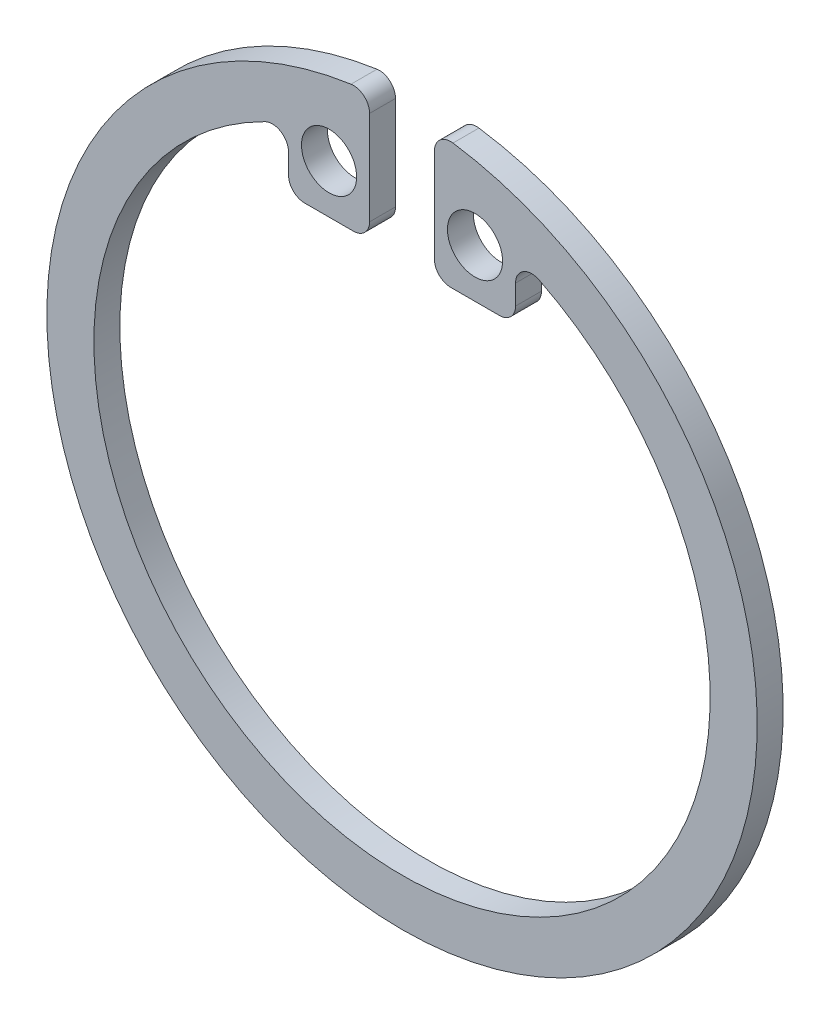
ISO-10303-21;
HEADER;
FILE_DESCRIPTION(('STEP AP214'),'2;1');
FILE_NAME('part.step','',(''),(''),'','','');
FILE_SCHEMA(('AUTOMOTIVE_DESIGN { 1 0 10303 214 1 1 1 1 }'));
ENDSEC;
DATA;
#1=APPLICATION_CONTEXT('core data for automotive mechanical design processes');
#2=APPLICATION_PROTOCOL_DEFINITION('international standard','automotive_design',2000,#1);
#3=PRODUCT_CONTEXT('',#1,'mechanical');
#4=PRODUCT('Part','Part','',(#3));
#5=PRODUCT_RELATED_PRODUCT_CATEGORY('part','',(#4));
#6=PRODUCT_DEFINITION_FORMATION('','',#4);
#7=PRODUCT_DEFINITION_CONTEXT('part definition',#1,'design');
#8=PRODUCT_DEFINITION('design','',#6,#7);
#9=PRODUCT_DEFINITION_SHAPE('','',#8);
#10=(LENGTH_UNIT() NAMED_UNIT(*) SI_UNIT(.MILLI.,.METRE.));
#11=(NAMED_UNIT(*) PLANE_ANGLE_UNIT() SI_UNIT($,.RADIAN.));
#12=(NAMED_UNIT(*) SI_UNIT($,.STERADIAN.) SOLID_ANGLE_UNIT());
#13=UNCERTAINTY_MEASURE_WITH_UNIT(LENGTH_MEASURE(1.E-05),#10,'distance_accuracy_value','');
#14=(GEOMETRIC_REPRESENTATION_CONTEXT(3) GLOBAL_UNCERTAINTY_ASSIGNED_CONTEXT((#13)) GLOBAL_UNIT_ASSIGNED_CONTEXT((#10,
#11,#12)) REPRESENTATION_CONTEXT('',''));
#15=CARTESIAN_POINT('',(0.,0.,0.));
#16=DIRECTION('',(0.,0.,1.));
#17=DIRECTION('',(1.,0.,0.));
#18=AXIS2_PLACEMENT_3D('',#15,#16,#17);
#19=CARTESIAN_POINT('',(0.,0.,0.8));
#20=DIRECTION('',(0.,0.,1.));
#21=DIRECTION('',(1.,0.,0.));
#22=AXIS2_PLACEMENT_3D('',#19,#20,#21);
#23=PLANE('',#22);
#24=CARTESIAN_POINT('',(2.25,8.44722181384559,0.8));
#25=DIRECTION('',(0.,0.,1.));
#26=DIRECTION('',(1.,0.,0.));
#27=AXIS2_PLACEMENT_3D('',#24,#25,#26);
#28=CIRCLE('',#27,0.85);
#29=CARTESIAN_POINT('',(3.1,8.44722181384559,0.8));
#30=VERTEX_POINT('',#29);
#31=EDGE_CURVE('E493',#30,#30,#28,.T.);
#32=ORIENTED_EDGE('',*,*,#31,.F.);
#33=EDGE_LOOP('',(#32));
#34=FACE_BOUND('',#33,.T.);
#35=CARTESIAN_POINT('',(-2.25,8.44722181384559,0.8));
#36=DIRECTION('',(0.,0.,1.));
#37=DIRECTION('',(1.,0.,0.));
#38=AXIS2_PLACEMENT_3D('',#35,#36,#37);
#39=CIRCLE('',#38,0.85);
#40=CARTESIAN_POINT('',(-1.4,8.44722181384559,0.8));
#41=VERTEX_POINT('',#40);
#42=EDGE_CURVE('E498',#41,#41,#39,.T.);
#43=ORIENTED_EDGE('',*,*,#42,.F.);
#44=EDGE_LOOP('',(#43));
#45=FACE_BOUND('',#44,.T.);
#46=DIRECTION('',(1.,0.,0.));
#47=VECTOR('',#46,1.);
#48=CARTESIAN_POINT('',(1.,6.94722181384559,0.8));
#49=LINE('',#48,#47);
#50=CARTESIAN_POINT('',(1.5,6.94722181384559,0.8));
#51=VERTEX_POINT('',#50);
#52=CARTESIAN_POINT('',(3.,6.94722181384559,0.8));
#53=VERTEX_POINT('',#52);
#54=EDGE_CURVE('E280',#51,#53,#49,.T.);
#55=ORIENTED_EDGE('',*,*,#54,.T.);
#56=CARTESIAN_POINT('',(3.,7.44722181384559,0.8));
#57=DIRECTION('',(0.,0.,1.));
#58=DIRECTION('',(1.,0.,0.));
#59=AXIS2_PLACEMENT_3D('',#56,#57,#58);
#60=CIRCLE('',#59,0.5);
#61=CARTESIAN_POINT('',(3.5,7.44722181384559,0.8));
#62=VERTEX_POINT('',#61);
#63=EDGE_CURVE('E232',#53,#62,#60,.T.);
#64=ORIENTED_EDGE('',*,*,#63,.T.);
#65=DIRECTION('',(0.,1.,0.));
#66=VECTOR('',#65,1.);
#67=CARTESIAN_POINT('',(3.5,9.44722181384559,0.8));
#68=LINE('',#67,#66);
#69=CARTESIAN_POINT('',(3.5,8.06225774829855,0.8));
#70=VERTEX_POINT('',#69);
#71=EDGE_CURVE('E279',#62,#70,#68,.T.);
#72=ORIENTED_EDGE('',*,*,#71,.T.);
#73=CARTESIAN_POINT('',(4.,8.06225774829855,0.8));
#74=DIRECTION('',(0.,0.,1.));
#75=DIRECTION('',(1.,0.,0.));
#76=AXIS2_PLACEMENT_3D('',#73,#74,#75);
#77=CIRCLE('',#76,0.5);
#78=CARTESIAN_POINT('',(4.22222222222222,8.51016095653736,0.8));
#79=VERTEX_POINT('',#78);
#80=EDGE_CURVE('E169',#70,#79,#77,.F.);
#81=ORIENTED_EDGE('',*,*,#80,.T.);
#82=CARTESIAN_POINT('',(0.,0.,0.8));
#83=DIRECTION('',(0.,0.,1.));
#84=DIRECTION('',(1.,0.,0.));
#85=AXIS2_PLACEMENT_3D('',#82,#83,#84);
#86=CIRCLE('',#85,9.5);
#87=CARTESIAN_POINT('',(-4.22222222222222,8.51016095653736,0.8));
#88=VERTEX_POINT('',#87);
#89=EDGE_CURVE('E165',#88,#79,#86,.T.);
#90=ORIENTED_EDGE('',*,*,#89,.F.);
#91=CARTESIAN_POINT('',(-4.,8.06225774829855,0.8));
#92=DIRECTION('',(0.,0.,1.));
#93=DIRECTION('',(1.,0.,0.));
#94=AXIS2_PLACEMENT_3D('',#91,#92,#93);
#95=CIRCLE('',#94,0.5);
#96=CARTESIAN_POINT('',(-3.5,8.06225774829855,0.8));
#97=VERTEX_POINT('',#96);
#98=EDGE_CURVE('E160',#88,#97,#95,.F.);
#99=ORIENTED_EDGE('',*,*,#98,.T.);
#100=DIRECTION('',(0.,-1.,0.));
#101=VECTOR('',#100,1.);
#102=CARTESIAN_POINT('',(-3.5,9.44722181384559,0.8));
#103=LINE('',#102,#101);
#104=CARTESIAN_POINT('',(-3.5,7.44722181384559,0.8));
#105=VERTEX_POINT('',#104);
#106=EDGE_CURVE('E163',#97,#105,#103,.T.);
#107=ORIENTED_EDGE('',*,*,#106,.T.);
#108=CARTESIAN_POINT('',(-3.,7.44722181384559,0.8));
#109=DIRECTION('',(0.,0.,1.));
#110=DIRECTION('',(1.,0.,0.));
#111=AXIS2_PLACEMENT_3D('',#108,#109,#110);
#112=CIRCLE('',#111,0.5);
#113=CARTESIAN_POINT('',(-3.,6.94722181384559,0.8));
#114=VERTEX_POINT('',#113);
#115=EDGE_CURVE('E226',#105,#114,#112,.T.);
#116=ORIENTED_EDGE('',*,*,#115,.T.);
#117=DIRECTION('',(1.,0.,0.));
#118=VECTOR('',#117,1.);
#119=CARTESIAN_POINT('',(-1.,6.94722181384559,0.8));
#120=LINE('',#119,#118);
#121=CARTESIAN_POINT('',(-1.5,6.94722181384559,0.8));
#122=VERTEX_POINT('',#121);
#123=EDGE_CURVE('E177',#114,#122,#120,.T.);
#124=ORIENTED_EDGE('',*,*,#123,.T.);
#125=CARTESIAN_POINT('',(-1.5,7.44722181384559,0.8));
#126=DIRECTION('',(0.,0.,1.));
#127=DIRECTION('',(1.,0.,0.));
#128=AXIS2_PLACEMENT_3D('',#125,#126,#127);
#129=CIRCLE('',#128,0.5);
#130=CARTESIAN_POINT('',(-1.,7.44722181384559,0.8));
#131=VERTEX_POINT('',#130);
#132=EDGE_CURVE('E228',#122,#131,#129,.T.);
#133=ORIENTED_EDGE('',*,*,#132,.T.);
#134=DIRECTION('',(0.,1.,0.));
#135=VECTOR('',#134,1.);
#136=CARTESIAN_POINT('',(-1.,0.,0.8));
#137=LINE('',#136,#135);
#138=CARTESIAN_POINT('',(-1.,10.3417841787575,0.8));
#139=VERTEX_POINT('',#138);
#140=EDGE_CURVE('E255',#131,#139,#137,.T.);
#141=ORIENTED_EDGE('',*,*,#140,.T.);
#142=CARTESIAN_POINT('',(-1.5,10.3417841787575,0.8));
#143=DIRECTION('',(0.,0.,1.));
#144=DIRECTION('',(1.,0.,0.));
#145=AXIS2_PLACEMENT_3D('',#142,#143,#144);
#146=CIRCLE('',#145,0.5);
#147=CARTESIAN_POINT('',(-1.57177033492823,10.8366063882675,0.8));
#148=VERTEX_POINT('',#147);
#149=EDGE_CURVE('E201',#139,#148,#146,.T.);
#150=ORIENTED_EDGE('',*,*,#149,.T.);
#151=CARTESIAN_POINT('',(0.,0.,0.8));
#152=DIRECTION('',(0.,0.,1.));
#153=DIRECTION('',(1.,0.,0.));
#154=AXIS2_PLACEMENT_3D('',#151,#152,#153);
#155=CIRCLE('',#154,10.95);
#156=CARTESIAN_POINT('',(1.57177033492823,10.8366063882675,0.8));
#157=VERTEX_POINT('',#156);
#158=EDGE_CURVE('E183',#148,#157,#155,.T.);
#159=ORIENTED_EDGE('',*,*,#158,.T.);
#160=CARTESIAN_POINT('',(1.5,10.3417841787575,0.8));
#161=DIRECTION('',(0.,0.,1.));
#162=DIRECTION('',(1.,0.,0.));
#163=AXIS2_PLACEMENT_3D('',#160,#161,#162);
#164=CIRCLE('',#163,0.5);
#165=CARTESIAN_POINT('',(1.,10.3417841787575,0.8));
#166=VERTEX_POINT('',#165);
#167=EDGE_CURVE('E203',#157,#166,#164,.T.);
#168=ORIENTED_EDGE('',*,*,#167,.T.);
#169=DIRECTION('',(0.,1.,0.));
#170=VECTOR('',#169,1.);
#171=CARTESIAN_POINT('',(1.,0.,0.8));
#172=LINE('',#171,#170);
#173=CARTESIAN_POINT('',(1.,7.44722181384559,0.8));
#174=VERTEX_POINT('',#173);
#175=EDGE_CURVE('E264',#174,#166,#172,.T.);
#176=ORIENTED_EDGE('',*,*,#175,.F.);
#177=CARTESIAN_POINT('',(1.5,7.44722181384559,0.8));
#178=DIRECTION('',(0.,0.,1.));
#179=DIRECTION('',(1.,0.,0.));
#180=AXIS2_PLACEMENT_3D('',#177,#178,#179);
#181=CIRCLE('',#180,0.5);
#182=EDGE_CURVE('E230',#174,#51,#181,.T.);
#183=ORIENTED_EDGE('',*,*,#182,.T.);
#184=EDGE_LOOP('',(#55,#64,#72,#81,#90,#99,#107,#116,#124,#133,#141,#150,#159,#168,#176,#183));
#185=FACE_BOUND('',#184,.T.);
#186=ADVANCED_FACE('F44',(#34,#45,#185),#23,.T.);
#187=CARTESIAN_POINT('',(0.,0.,0.));
#188=DIRECTION('',(0.,0.,1.));
#189=DIRECTION('',(1.,0.,0.));
#190=AXIS2_PLACEMENT_3D('',#187,#188,#189);
#191=PLANE('',#190);
#192=CARTESIAN_POINT('',(2.25,8.44722181384559,0.));
#193=DIRECTION('',(0.,0.,1.));
#194=DIRECTION('',(1.,0.,0.));
#195=AXIS2_PLACEMENT_3D('',#192,#193,#194);
#196=CIRCLE('',#195,0.85);
#197=CARTESIAN_POINT('',(3.1,8.44722181384559,0.));
#198=VERTEX_POINT('',#197);
#199=EDGE_CURVE('E178',#198,#198,#196,.T.);
#200=ORIENTED_EDGE('',*,*,#199,.T.);
#201=EDGE_LOOP('',(#200));
#202=FACE_BOUND('',#201,.T.);
#203=CARTESIAN_POINT('',(-2.25,8.44722181384559,0.));
#204=DIRECTION('',(0.,0.,1.));
#205=DIRECTION('',(1.,0.,0.));
#206=AXIS2_PLACEMENT_3D('',#203,#204,#205);
#207=CIRCLE('',#206,0.85);
#208=CARTESIAN_POINT('',(-1.4,8.44722181384559,0.));
#209=VERTEX_POINT('',#208);
#210=EDGE_CURVE('E494',#209,#209,#207,.T.);
#211=ORIENTED_EDGE('',*,*,#210,.T.);
#212=EDGE_LOOP('',(#211));
#213=FACE_BOUND('',#212,.T.);
#214=DIRECTION('',(0.,-1.,0.));
#215=VECTOR('',#214,1.);
#216=CARTESIAN_POINT('',(3.5,9.44722181384559,0.));
#217=LINE('',#216,#215);
#218=CARTESIAN_POINT('',(3.5,8.06225774829855,0.));
#219=VERTEX_POINT('',#218);
#220=CARTESIAN_POINT('',(3.5,7.44722181384559,0.));
#221=VERTEX_POINT('',#220);
#222=EDGE_CURVE('E276',#219,#221,#217,.T.);
#223=ORIENTED_EDGE('',*,*,#222,.T.);
#224=CARTESIAN_POINT('',(3.,7.44722181384559,0.));
#225=DIRECTION('',(0.,0.,1.));
#226=DIRECTION('',(1.,0.,0.));
#227=AXIS2_PLACEMENT_3D('',#224,#225,#226);
#228=CIRCLE('',#227,0.5);
#229=CARTESIAN_POINT('',(3.,6.94722181384559,0.));
#230=VERTEX_POINT('',#229);
#231=EDGE_CURVE('E241',#221,#230,#228,.F.);
#232=ORIENTED_EDGE('',*,*,#231,.T.);
#233=DIRECTION('',(-1.,0.,0.));
#234=VECTOR('',#233,1.);
#235=CARTESIAN_POINT('',(1.,6.94722181384559,0.));
#236=LINE('',#235,#234);
#237=CARTESIAN_POINT('',(1.5,6.94722181384559,0.));
#238=VERTEX_POINT('',#237);
#239=EDGE_CURVE('E278',#230,#238,#236,.T.);
#240=ORIENTED_EDGE('',*,*,#239,.T.);
#241=CARTESIAN_POINT('',(1.5,7.44722181384559,0.));
#242=DIRECTION('',(0.,0.,1.));
#243=DIRECTION('',(1.,0.,0.));
#244=AXIS2_PLACEMENT_3D('',#241,#242,#243);
#245=CIRCLE('',#244,0.5);
#246=CARTESIAN_POINT('',(1.,7.44722181384559,0.));
#247=VERTEX_POINT('',#246);
#248=EDGE_CURVE('E239',#238,#247,#245,.F.);
#249=ORIENTED_EDGE('',*,*,#248,.T.);
#250=DIRECTION('',(0.,1.,0.));
#251=VECTOR('',#250,1.);
#252=CARTESIAN_POINT('',(1.,0.,0.));
#253=LINE('',#252,#251);
#254=CARTESIAN_POINT('',(1.,10.3417841787575,0.));
#255=VERTEX_POINT('',#254);
#256=EDGE_CURVE('E263',#247,#255,#253,.T.);
#257=ORIENTED_EDGE('',*,*,#256,.T.);
#258=CARTESIAN_POINT('',(1.5,10.3417841787575,0.));
#259=DIRECTION('',(0.,0.,1.));
#260=DIRECTION('',(1.,0.,0.));
#261=AXIS2_PLACEMENT_3D('',#258,#259,#260);
#262=CIRCLE('',#261,0.5);
#263=CARTESIAN_POINT('',(1.57177033492823,10.8366063882675,0.));
#264=VERTEX_POINT('',#263);
#265=EDGE_CURVE('E212',#255,#264,#262,.F.);
#266=ORIENTED_EDGE('',*,*,#265,.T.);
#267=CARTESIAN_POINT('',(0.,0.,0.));
#268=DIRECTION('',(0.,0.,1.));
#269=DIRECTION('',(1.,0.,0.));
#270=AXIS2_PLACEMENT_3D('',#267,#268,#269);
#271=CIRCLE('',#270,10.95);
#272=CARTESIAN_POINT('',(-1.57177033492823,10.8366063882675,0.));
#273=VERTEX_POINT('',#272);
#274=EDGE_CURVE('E188',#273,#264,#271,.T.);
#275=ORIENTED_EDGE('',*,*,#274,.F.);
#276=CARTESIAN_POINT('',(-1.5,10.3417841787575,0.));
#277=DIRECTION('',(0.,0.,1.));
#278=DIRECTION('',(1.,0.,0.));
#279=AXIS2_PLACEMENT_3D('',#276,#277,#278);
#280=CIRCLE('',#279,0.5);
#281=CARTESIAN_POINT('',(-1.,10.3417841787575,0.));
#282=VERTEX_POINT('',#281);
#283=EDGE_CURVE('E209',#273,#282,#280,.F.);
#284=ORIENTED_EDGE('',*,*,#283,.T.);
#285=DIRECTION('',(0.,1.,0.));
#286=VECTOR('',#285,1.);
#287=CARTESIAN_POINT('',(-1.,0.,0.));
#288=LINE('',#287,#286);
#289=CARTESIAN_POINT('',(-1.,7.44722181384559,0.));
#290=VERTEX_POINT('',#289);
#291=EDGE_CURVE('E254',#290,#282,#288,.T.);
#292=ORIENTED_EDGE('',*,*,#291,.F.);
#293=CARTESIAN_POINT('',(-1.5,7.44722181384559,0.));
#294=DIRECTION('',(0.,0.,1.));
#295=DIRECTION('',(1.,0.,0.));
#296=AXIS2_PLACEMENT_3D('',#293,#294,#295);
#297=CIRCLE('',#296,0.5);
#298=CARTESIAN_POINT('',(-1.5,6.94722181384559,0.));
#299=VERTEX_POINT('',#298);
#300=EDGE_CURVE('E237',#290,#299,#297,.F.);
#301=ORIENTED_EDGE('',*,*,#300,.T.);
#302=DIRECTION('',(-1.,0.,0.));
#303=VECTOR('',#302,1.);
#304=CARTESIAN_POINT('',(-1.,6.94722181384559,0.));
#305=LINE('',#304,#303);
#306=CARTESIAN_POINT('',(-3.,6.94722181384559,0.));
#307=VERTEX_POINT('',#306);
#308=EDGE_CURVE('E270',#299,#307,#305,.T.);
#309=ORIENTED_EDGE('',*,*,#308,.T.);
#310=CARTESIAN_POINT('',(-3.,7.44722181384559,0.));
#311=DIRECTION('',(0.,0.,1.));
#312=DIRECTION('',(1.,0.,0.));
#313=AXIS2_PLACEMENT_3D('',#310,#311,#312);
#314=CIRCLE('',#313,0.5);
#315=CARTESIAN_POINT('',(-3.5,7.44722181384559,0.));
#316=VERTEX_POINT('',#315);
#317=EDGE_CURVE('E59',#307,#316,#314,.F.);
#318=ORIENTED_EDGE('',*,*,#317,.T.);
#319=DIRECTION('',(0.,1.,0.));
#320=VECTOR('',#319,1.);
#321=CARTESIAN_POINT('',(-3.5,9.44722181384559,0.));
#322=LINE('',#321,#320);
#323=CARTESIAN_POINT('',(-3.5,8.06225774829855,0.));
#324=VERTEX_POINT('',#323);
#325=EDGE_CURVE('E271',#316,#324,#322,.T.);
#326=ORIENTED_EDGE('',*,*,#325,.T.);
#327=CARTESIAN_POINT('',(-4.,8.06225774829855,0.));
#328=DIRECTION('',(0.,0.,1.));
#329=DIRECTION('',(1.,0.,0.));
#330=AXIS2_PLACEMENT_3D('',#327,#328,#329);
#331=CIRCLE('',#330,0.5);
#332=CARTESIAN_POINT('',(-4.22222222222222,8.51016095653736,0.));
#333=VERTEX_POINT('',#332);
#334=EDGE_CURVE('E170',#324,#333,#331,.T.);
#335=ORIENTED_EDGE('',*,*,#334,.T.);
#336=CARTESIAN_POINT('',(0.,0.,0.));
#337=DIRECTION('',(0.,0.,1.));
#338=DIRECTION('',(1.,0.,0.));
#339=AXIS2_PLACEMENT_3D('',#336,#337,#338);
#340=CIRCLE('',#339,9.5);
#341=CARTESIAN_POINT('',(4.22222222222222,8.51016095653736,0.));
#342=VERTEX_POINT('',#341);
#343=EDGE_CURVE('E286',#333,#342,#340,.T.);
#344=ORIENTED_EDGE('',*,*,#343,.T.);
#345=CARTESIAN_POINT('',(4.,8.06225774829855,0.));
#346=DIRECTION('',(0.,0.,1.));
#347=DIRECTION('',(1.,0.,0.));
#348=AXIS2_PLACEMENT_3D('',#345,#346,#347);
#349=CIRCLE('',#348,0.5);
#350=EDGE_CURVE('E219',#342,#219,#349,.T.);
#351=ORIENTED_EDGE('',*,*,#350,.T.);
#352=EDGE_LOOP('',(#223,#232,#240,#249,#257,#266,#275,#284,#292,#301,#309,#318,#326,#335,#344,#351));
#353=FACE_BOUND('',#352,.T.);
#354=ADVANCED_FACE('F259',(#202,#213,#353),#191,.F.);
#355=CARTESIAN_POINT('',(0.,0.,0.8));
#356=DIRECTION('',(0.,0.,-1.));
#357=DIRECTION('',(-1.,0.,0.));
#358=AXIS2_PLACEMENT_3D('',#355,#356,#357);
#359=CYLINDRICAL_SURFACE('',#358,10.95);
#360=ORIENTED_EDGE('',*,*,#274,.T.);
#361=DIRECTION('',(0.,0.,-1.));
#362=VECTOR('',#361,1.);
#363=CARTESIAN_POINT('',(1.57177033492823,10.8366063882675,0.8));
#364=LINE('',#363,#362);
#365=EDGE_CURVE('E198',#264,#157,#364,.F.);
#366=ORIENTED_EDGE('',*,*,#365,.T.);
#367=ORIENTED_EDGE('',*,*,#158,.F.);
#368=DIRECTION('',(0.,0.,-1.));
#369=VECTOR('',#368,1.);
#370=CARTESIAN_POINT('',(-1.57177033492823,10.8366063882675,0.8));
#371=LINE('',#370,#369);
#372=EDGE_CURVE('E196',#148,#273,#371,.T.);
#373=ORIENTED_EDGE('',*,*,#372,.T.);
#374=EDGE_LOOP('',(#360,#366,#367,#373));
#375=FACE_BOUND('',#374,.T.);
#376=ADVANCED_FACE('F327',(#375),#359,.T.);
#377=CARTESIAN_POINT('',(0.,0.,0.8));
#378=DIRECTION('',(0.,0.,-1.));
#379=DIRECTION('',(-1.,0.,0.));
#380=AXIS2_PLACEMENT_3D('',#377,#378,#379);
#381=CYLINDRICAL_SURFACE('',#380,9.5);
#382=ORIENTED_EDGE('',*,*,#343,.F.);
#383=DIRECTION('',(0.,0.,-1.));
#384=VECTOR('',#383,1.);
#385=CARTESIAN_POINT('',(-4.22222222222222,8.51016095653736,0.8));
#386=LINE('',#385,#384);
#387=EDGE_CURVE('E185',#333,#88,#386,.F.);
#388=ORIENTED_EDGE('',*,*,#387,.T.);
#389=ORIENTED_EDGE('',*,*,#89,.T.);
#390=DIRECTION('',(0.,0.,-1.));
#391=VECTOR('',#390,1.);
#392=CARTESIAN_POINT('',(4.22222222222222,8.51016095653736,0.8));
#393=LINE('',#392,#391);
#394=EDGE_CURVE('E182',#79,#342,#393,.T.);
#395=ORIENTED_EDGE('',*,*,#394,.T.);
#396=EDGE_LOOP('',(#382,#388,#389,#395));
#397=FACE_BOUND('',#396,.T.);
#398=ADVANCED_FACE('F353',(#397),#381,.F.);
#399=CARTESIAN_POINT('',(1.,0.,0.));
#400=DIRECTION('',(1.,0.,0.));
#401=DIRECTION('',(0.,0.,-1.));
#402=AXIS2_PLACEMENT_3D('',#399,#400,#401);
#403=PLANE('',#402);
#404=ORIENTED_EDGE('',*,*,#256,.F.);
#405=DIRECTION('',(0.,0.,1.));
#406=VECTOR('',#405,1.);
#407=CARTESIAN_POINT('',(1.,7.44722181384559,0.8));
#408=LINE('',#407,#406);
#409=EDGE_CURVE('E243',#247,#174,#408,.T.);
#410=ORIENTED_EDGE('',*,*,#409,.T.);
#411=ORIENTED_EDGE('',*,*,#175,.T.);
#412=DIRECTION('',(0.,0.,-1.));
#413=VECTOR('',#412,1.);
#414=CARTESIAN_POINT('',(1.,10.3417841787575,0.));
#415=LINE('',#414,#413);
#416=EDGE_CURVE('E206',#166,#255,#415,.T.);
#417=ORIENTED_EDGE('',*,*,#416,.T.);
#418=EDGE_LOOP('',(#404,#410,#411,#417));
#419=FACE_BOUND('',#418,.T.);
#420=ADVANCED_FACE('F320',(#419),#403,.F.);
#421=CARTESIAN_POINT('',(-1.,0.,0.));
#422=DIRECTION('',(1.,0.,0.));
#423=DIRECTION('',(0.,0.,-1.));
#424=AXIS2_PLACEMENT_3D('',#421,#422,#423);
#425=PLANE('',#424);
#426=ORIENTED_EDGE('',*,*,#140,.F.);
#427=DIRECTION('',(0.,0.,1.));
#428=VECTOR('',#427,1.);
#429=CARTESIAN_POINT('',(-1.,7.44722181384559,0.));
#430=LINE('',#429,#428);
#431=EDGE_CURVE('E52',#131,#290,#430,.F.);
#432=ORIENTED_EDGE('',*,*,#431,.T.);
#433=ORIENTED_EDGE('',*,*,#291,.T.);
#434=DIRECTION('',(0.,0.,1.));
#435=VECTOR('',#434,1.);
#436=CARTESIAN_POINT('',(-1.,10.3417841787575,0.8));
#437=LINE('',#436,#435);
#438=EDGE_CURVE('E214',#282,#139,#437,.T.);
#439=ORIENTED_EDGE('',*,*,#438,.T.);
#440=EDGE_LOOP('',(#426,#432,#433,#439));
#441=FACE_BOUND('',#440,.T.);
#442=ADVANCED_FACE('F253',(#441),#425,.T.);
#443=CARTESIAN_POINT('',(3.5,9.44722181384559,-3.53553390593274));
#444=DIRECTION('',(1.,0.,0.));
#445=DIRECTION('',(0.,1.,0.));
#446=AXIS2_PLACEMENT_3D('',#443,#444,#445);
#447=PLANE('',#446);
#448=ORIENTED_EDGE('',*,*,#71,.F.);
#449=DIRECTION('',(0.,0.,1.));
#450=VECTOR('',#449,1.);
#451=CARTESIAN_POINT('',(3.5,7.44722181384559,-3.53553390593274));
#452=LINE('',#451,#450);
#453=EDGE_CURVE('E234',#62,#221,#452,.F.);
#454=ORIENTED_EDGE('',*,*,#453,.T.);
#455=ORIENTED_EDGE('',*,*,#222,.F.);
#456=DIRECTION('',(0.,0.,1.));
#457=VECTOR('',#456,1.);
#458=CARTESIAN_POINT('',(3.5,8.06225774829855,0.8));
#459=LINE('',#458,#457);
#460=EDGE_CURVE('E193',#219,#70,#459,.T.);
#461=ORIENTED_EDGE('',*,*,#460,.T.);
#462=EDGE_LOOP('',(#448,#454,#455,#461));
#463=FACE_BOUND('',#462,.T.);
#464=ADVANCED_FACE('F302',(#463),#447,.T.);
#465=CARTESIAN_POINT('',(1.,6.94722181384559,-3.53553390593274));
#466=DIRECTION('',(0.,-1.,0.));
#467=DIRECTION('',(0.,0.,-1.));
#468=AXIS2_PLACEMENT_3D('',#465,#466,#467);
#469=PLANE('',#468);
#470=ORIENTED_EDGE('',*,*,#239,.F.);
#471=DIRECTION('',(0.,0.,1.));
#472=VECTOR('',#471,1.);
#473=CARTESIAN_POINT('',(3.,6.94722181384559,-3.53553390593274));
#474=LINE('',#473,#472);
#475=EDGE_CURVE('E223',#230,#53,#474,.T.);
#476=ORIENTED_EDGE('',*,*,#475,.T.);
#477=ORIENTED_EDGE('',*,*,#54,.F.);
#478=DIRECTION('',(0.,0.,1.));
#479=VECTOR('',#478,1.);
#480=CARTESIAN_POINT('',(1.5,6.94722181384559,0.));
#481=LINE('',#480,#479);
#482=EDGE_CURVE('E221',#51,#238,#481,.F.);
#483=ORIENTED_EDGE('',*,*,#482,.T.);
#484=EDGE_LOOP('',(#470,#476,#477,#483));
#485=FACE_BOUND('',#484,.T.);
#486=ADVANCED_FACE('F311',(#485),#469,.T.);
#487=CARTESIAN_POINT('',(-1.,6.94722181384559,-3.53553390593274));
#488=DIRECTION('',(0.,-1.,0.));
#489=DIRECTION('',(0.,0.,-1.));
#490=AXIS2_PLACEMENT_3D('',#487,#488,#489);
#491=PLANE('',#490);
#492=ORIENTED_EDGE('',*,*,#308,.F.);
#493=DIRECTION('',(0.,0.,1.));
#494=VECTOR('',#493,1.);
#495=CARTESIAN_POINT('',(-1.5,6.94722181384559,-3.53553390593274));
#496=LINE('',#495,#494);
#497=EDGE_CURVE('E247',#299,#122,#496,.T.);
#498=ORIENTED_EDGE('',*,*,#497,.T.);
#499=ORIENTED_EDGE('',*,*,#123,.F.);
#500=DIRECTION('',(0.,0.,1.));
#501=VECTOR('',#500,1.);
#502=CARTESIAN_POINT('',(-3.,6.94722181384559,-3.53553390593274));
#503=LINE('',#502,#501);
#504=EDGE_CURVE('E67',#114,#307,#503,.F.);
#505=ORIENTED_EDGE('',*,*,#504,.T.);
#506=EDGE_LOOP('',(#492,#498,#499,#505));
#507=FACE_BOUND('',#506,.T.);
#508=ADVANCED_FACE('F269',(#507),#491,.T.);
#509=CARTESIAN_POINT('',(-3.5,9.44722181384559,-3.53553390593274));
#510=DIRECTION('',(-1.,0.,0.));
#511=DIRECTION('',(0.,-1.,0.));
#512=AXIS2_PLACEMENT_3D('',#509,#510,#511);
#513=PLANE('',#512);
#514=ORIENTED_EDGE('',*,*,#325,.F.);
#515=DIRECTION('',(0.,0.,1.));
#516=VECTOR('',#515,1.);
#517=CARTESIAN_POINT('',(-3.5,7.44722181384559,-3.53553390593274));
#518=LINE('',#517,#516);
#519=EDGE_CURVE('E13',#316,#105,#518,.T.);
#520=ORIENTED_EDGE('',*,*,#519,.T.);
#521=ORIENTED_EDGE('',*,*,#106,.F.);
#522=DIRECTION('',(0.,0.,1.));
#523=VECTOR('',#522,1.);
#524=CARTESIAN_POINT('',(-3.5,8.06225774829855,0.));
#525=LINE('',#524,#523);
#526=EDGE_CURVE('E175',#97,#324,#525,.F.);
#527=ORIENTED_EDGE('',*,*,#526,.T.);
#528=EDGE_LOOP('',(#514,#520,#521,#527));
#529=FACE_BOUND('',#528,.T.);
#530=ADVANCED_FACE('F174',(#529),#513,.T.);
#531=CARTESIAN_POINT('',(-4.,8.06225774829855,0.8));
#532=DIRECTION('',(0.,0.,-1.));
#533=DIRECTION('',(-1.,0.,0.));
#534=AXIS2_PLACEMENT_3D('',#531,#532,#533);
#535=CYLINDRICAL_SURFACE('',#534,0.5);
#536=ORIENTED_EDGE('',*,*,#98,.F.);
#537=ORIENTED_EDGE('',*,*,#387,.F.);
#538=ORIENTED_EDGE('',*,*,#334,.F.);
#539=ORIENTED_EDGE('',*,*,#526,.F.);
#540=EDGE_LOOP('',(#536,#537,#538,#539));
#541=FACE_BOUND('',#540,.T.);
#542=ADVANCED_FACE('F181',(#541),#535,.F.);
#543=CARTESIAN_POINT('',(4.,8.06225774829855,0.8));
#544=DIRECTION('',(0.,0.,-1.));
#545=DIRECTION('',(-1.,0.,0.));
#546=AXIS2_PLACEMENT_3D('',#543,#544,#545);
#547=CYLINDRICAL_SURFACE('',#546,0.5);
#548=ORIENTED_EDGE('',*,*,#350,.F.);
#549=ORIENTED_EDGE('',*,*,#394,.F.);
#550=ORIENTED_EDGE('',*,*,#80,.F.);
#551=ORIENTED_EDGE('',*,*,#460,.F.);
#552=EDGE_LOOP('',(#548,#549,#550,#551));
#553=FACE_BOUND('',#552,.T.);
#554=ADVANCED_FACE('F298',(#553),#547,.F.);
#555=CARTESIAN_POINT('',(1.5,10.3417841787575,0.8));
#556=DIRECTION('',(0.,0.,-1.));
#557=DIRECTION('',(-1.,0.,0.));
#558=AXIS2_PLACEMENT_3D('',#555,#556,#557);
#559=CYLINDRICAL_SURFACE('',#558,0.5);
#560=ORIENTED_EDGE('',*,*,#265,.F.);
#561=ORIENTED_EDGE('',*,*,#416,.F.);
#562=ORIENTED_EDGE('',*,*,#167,.F.);
#563=ORIENTED_EDGE('',*,*,#365,.F.);
#564=EDGE_LOOP('',(#560,#561,#562,#563));
#565=FACE_BOUND('',#564,.T.);
#566=ADVANCED_FACE('F330',(#565),#559,.T.);
#567=CARTESIAN_POINT('',(-1.5,10.3417841787575,0.8));
#568=DIRECTION('',(0.,0.,-1.));
#569=DIRECTION('',(-1.,0.,0.));
#570=AXIS2_PLACEMENT_3D('',#567,#568,#569);
#571=CYLINDRICAL_SURFACE('',#570,0.5);
#572=ORIENTED_EDGE('',*,*,#283,.F.);
#573=ORIENTED_EDGE('',*,*,#372,.F.);
#574=ORIENTED_EDGE('',*,*,#149,.F.);
#575=ORIENTED_EDGE('',*,*,#438,.F.);
#576=EDGE_LOOP('',(#572,#573,#574,#575));
#577=FACE_BOUND('',#576,.T.);
#578=ADVANCED_FACE('F333',(#577),#571,.T.);
#579=CARTESIAN_POINT('',(3.,7.44722181384559,-3.53553390593274));
#580=DIRECTION('',(0.,0.,1.));
#581=DIRECTION('',(1.,0.,0.));
#582=AXIS2_PLACEMENT_3D('',#579,#580,#581);
#583=CYLINDRICAL_SURFACE('',#582,0.5);
#584=ORIENTED_EDGE('',*,*,#231,.F.);
#585=ORIENTED_EDGE('',*,*,#453,.F.);
#586=ORIENTED_EDGE('',*,*,#63,.F.);
#587=ORIENTED_EDGE('',*,*,#475,.F.);
#588=EDGE_LOOP('',(#584,#585,#586,#587));
#589=FACE_BOUND('',#588,.T.);
#590=ADVANCED_FACE('F308',(#589),#583,.T.);
#591=CARTESIAN_POINT('',(1.5,7.44722181384559,0.));
#592=DIRECTION('',(0.,0.,-1.));
#593=DIRECTION('',(-1.,0.,0.));
#594=AXIS2_PLACEMENT_3D('',#591,#592,#593);
#595=CYLINDRICAL_SURFACE('',#594,0.5);
#596=ORIENTED_EDGE('',*,*,#248,.F.);
#597=ORIENTED_EDGE('',*,*,#482,.F.);
#598=ORIENTED_EDGE('',*,*,#182,.F.);
#599=ORIENTED_EDGE('',*,*,#409,.F.);
#600=EDGE_LOOP('',(#596,#597,#598,#599));
#601=FACE_BOUND('',#600,.T.);
#602=ADVANCED_FACE('F317',(#601),#595,.T.);
#603=CARTESIAN_POINT('',(-1.5,7.44722181384559,-3.53553390593274));
#604=DIRECTION('',(0.,0.,1.));
#605=DIRECTION('',(1.,0.,0.));
#606=AXIS2_PLACEMENT_3D('',#603,#604,#605);
#607=CYLINDRICAL_SURFACE('',#606,0.5);
#608=ORIENTED_EDGE('',*,*,#300,.F.);
#609=ORIENTED_EDGE('',*,*,#431,.F.);
#610=ORIENTED_EDGE('',*,*,#132,.F.);
#611=ORIENTED_EDGE('',*,*,#497,.F.);
#612=EDGE_LOOP('',(#608,#609,#610,#611));
#613=FACE_BOUND('',#612,.T.);
#614=ADVANCED_FACE('F267',(#613),#607,.T.);
#615=CARTESIAN_POINT('',(-3.,7.44722181384559,-3.53553390593274));
#616=DIRECTION('',(0.,0.,1.));
#617=DIRECTION('',(1.,0.,0.));
#618=AXIS2_PLACEMENT_3D('',#615,#616,#617);
#619=CYLINDRICAL_SURFACE('',#618,0.5);
#620=ORIENTED_EDGE('',*,*,#317,.F.);
#621=ORIENTED_EDGE('',*,*,#504,.F.);
#622=ORIENTED_EDGE('',*,*,#115,.F.);
#623=ORIENTED_EDGE('',*,*,#519,.F.);
#624=EDGE_LOOP('',(#620,#621,#622,#623));
#625=FACE_BOUND('',#624,.T.);
#626=ADVANCED_FACE('F46',(#625),#619,.T.);
#627=CARTESIAN_POINT('',(-2.25,8.44722181384559,0.));
#628=DIRECTION('',(0.,0.,1.));
#629=DIRECTION('',(1.,0.,0.));
#630=AXIS2_PLACEMENT_3D('',#627,#628,#629);
#631=CYLINDRICAL_SURFACE('',#630,0.85);
#632=ORIENTED_EDGE('',*,*,#210,.F.);
#633=EDGE_LOOP('',(#632));
#634=FACE_BOUND('',#633,.T.);
#635=ORIENTED_EDGE('',*,*,#42,.T.);
#636=EDGE_LOOP('',(#635));
#637=FACE_BOUND('',#636,.T.);
#638=ADVANCED_FACE('F454',(#634,#637),#631,.F.);
#639=CARTESIAN_POINT('',(2.25,8.44722181384559,0.));
#640=DIRECTION('',(0.,0.,1.));
#641=DIRECTION('',(1.,0.,0.));
#642=AXIS2_PLACEMENT_3D('',#639,#640,#641);
#643=CYLINDRICAL_SURFACE('',#642,0.85);
#644=ORIENTED_EDGE('',*,*,#199,.F.);
#645=EDGE_LOOP('',(#644));
#646=FACE_BOUND('',#645,.T.);
#647=ORIENTED_EDGE('',*,*,#31,.T.);
#648=EDGE_LOOP('',(#647));
#649=FACE_BOUND('',#648,.T.);
#650=ADVANCED_FACE('F475',(#646,#649),#643,.F.);
#651=CLOSED_SHELL('',(#186,#354,#376,#398,#420,#442,#464,#486,#508,#530,#542,#554,#566,#578,
#590,#602,#614,#626,#638,#650));
#652=MANIFOLD_SOLID_BREP('B2',#651);
#653=ADVANCED_BREP_SHAPE_REPRESENTATION('',(#18,#652),#14);
#654=SHAPE_DEFINITION_REPRESENTATION(#9,#653);
ENDSEC;
END-ISO-10303-21;
